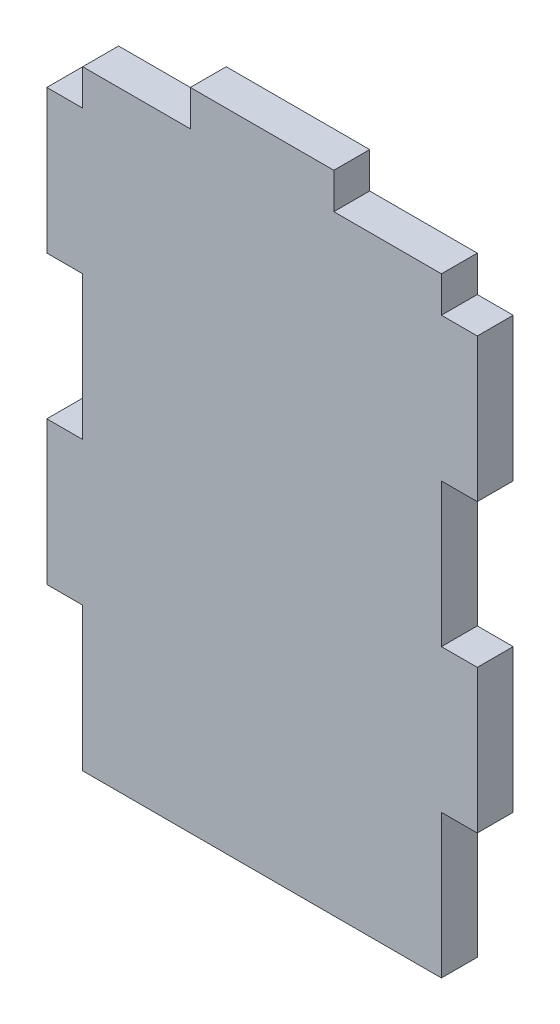
ISO-10303-21;
HEADER;
FILE_DESCRIPTION(('STEP AP214'),'2;1');
FILE_NAME('part.step','',(''),(''),'','','');
FILE_SCHEMA(('AUTOMOTIVE_DESIGN { 1 0 10303 214 1 1 1 1 }'));
ENDSEC;
DATA;
#1=APPLICATION_CONTEXT('core data for automotive mechanical design processes');
#2=APPLICATION_PROTOCOL_DEFINITION('international standard','automotive_design',2000,#1);
#3=PRODUCT_CONTEXT('',#1,'mechanical');
#4=PRODUCT('Part','Part','',(#3));
#5=PRODUCT_RELATED_PRODUCT_CATEGORY('part','',(#4));
#6=PRODUCT_DEFINITION_FORMATION('','',#4);
#7=PRODUCT_DEFINITION_CONTEXT('part definition',#1,'design');
#8=PRODUCT_DEFINITION('design','',#6,#7);
#9=PRODUCT_DEFINITION_SHAPE('','',#8);
#10=(LENGTH_UNIT() NAMED_UNIT(*) SI_UNIT(.MILLI.,.METRE.));
#11=(NAMED_UNIT(*) PLANE_ANGLE_UNIT() SI_UNIT($,.RADIAN.));
#12=(NAMED_UNIT(*) SI_UNIT($,.STERADIAN.) SOLID_ANGLE_UNIT());
#13=UNCERTAINTY_MEASURE_WITH_UNIT(LENGTH_MEASURE(1.E-05),#10,'distance_accuracy_value','');
#14=(GEOMETRIC_REPRESENTATION_CONTEXT(3) GLOBAL_UNCERTAINTY_ASSIGNED_CONTEXT((#13)) GLOBAL_UNIT_ASSIGNED_CONTEXT((#10,
#11,#12)) REPRESENTATION_CONTEXT('',''));
#15=CARTESIAN_POINT('',(0.,0.,0.));
#16=DIRECTION('',(0.,0.,1.));
#17=DIRECTION('',(1.,0.,0.));
#18=AXIS2_PLACEMENT_3D('',#15,#16,#17);
#19=CARTESIAN_POINT('',(-25.,42.5,5.));
#20=DIRECTION('',(0.,-1.,0.));
#21=DIRECTION('',(0.,0.,-1.));
#22=AXIS2_PLACEMENT_3D('',#19,#20,#21);
#23=PLANE('',#22);
#24=DIRECTION('',(0.,0.,1.));
#25=VECTOR('',#24,1.);
#26=CARTESIAN_POINT('',(-10.,42.5,-20.6155281280883));
#27=LINE('',#26,#25);
#28=CARTESIAN_POINT('',(-10.,42.5,0.));
#29=VERTEX_POINT('',#28);
#30=CARTESIAN_POINT('',(-10.,42.5,5.));
#31=VERTEX_POINT('',#30);
#32=EDGE_CURVE('E63',#29,#31,#27,.T.);
#33=ORIENTED_EDGE('',*,*,#32,.F.);
#34=DIRECTION('',(-1.,0.,0.));
#35=VECTOR('',#34,1.);
#36=CARTESIAN_POINT('',(-25.,42.5,0.));
#37=LINE('',#36,#35);
#38=CARTESIAN_POINT('',(-25.,42.5,0.));
#39=VERTEX_POINT('',#38);
#40=EDGE_CURVE('E406',#29,#39,#37,.T.);
#41=ORIENTED_EDGE('',*,*,#40,.T.);
#42=DIRECTION('',(0.,0.,-1.));
#43=VECTOR('',#42,1.);
#44=CARTESIAN_POINT('',(-25.,42.5,5.));
#45=LINE('',#44,#43);
#46=CARTESIAN_POINT('',(-25.,42.5,5.));
#47=VERTEX_POINT('',#46);
#48=EDGE_CURVE('E48',#47,#39,#45,.T.);
#49=ORIENTED_EDGE('',*,*,#48,.F.);
#50=DIRECTION('',(-1.,0.,0.));
#51=VECTOR('',#50,1.);
#52=CARTESIAN_POINT('',(-25.,42.5,5.));
#53=LINE('',#52,#51);
#54=EDGE_CURVE('E200',#31,#47,#53,.T.);
#55=ORIENTED_EDGE('',*,*,#54,.F.);
#56=EDGE_LOOP('',(#33,#41,#49,#55));
#57=FACE_BOUND('',#56,.T.);
#58=ADVANCED_FACE('F39',(#57),#23,.F.);
#59=CARTESIAN_POINT('',(25.,42.5,5.));
#60=DIRECTION('',(-1.,0.,0.));
#61=DIRECTION('',(0.,-1.,0.));
#62=AXIS2_PLACEMENT_3D('',#59,#60,#61);
#63=PLANE('',#62);
#64=DIRECTION('',(0.,0.,1.));
#65=VECTOR('',#64,1.);
#66=CARTESIAN_POINT('',(25.,17.5,-20.6155281280883));
#67=LINE('',#66,#65);
#68=CARTESIAN_POINT('',(25.,17.5,0.));
#69=VERTEX_POINT('',#68);
#70=CARTESIAN_POINT('',(25.,17.5,5.));
#71=VERTEX_POINT('',#70);
#72=EDGE_CURVE('E266',#69,#71,#67,.T.);
#73=ORIENTED_EDGE('',*,*,#72,.T.);
#74=DIRECTION('',(0.,1.,0.));
#75=VECTOR('',#74,1.);
#76=CARTESIAN_POINT('',(25.,42.5,5.));
#77=LINE('',#76,#75);
#78=CARTESIAN_POINT('',(25.,-2.50000000000001,5.));
#79=VERTEX_POINT('',#78);
#80=EDGE_CURVE('E389',#79,#71,#77,.T.);
#81=ORIENTED_EDGE('',*,*,#80,.F.);
#82=DIRECTION('',(0.,0.,1.));
#83=VECTOR('',#82,1.);
#84=CARTESIAN_POINT('',(25.,-2.50000000000001,-20.6155281280883));
#85=LINE('',#84,#83);
#86=CARTESIAN_POINT('',(25.,-2.50000000000001,0.));
#87=VERTEX_POINT('',#86);
#88=EDGE_CURVE('E302',#87,#79,#85,.T.);
#89=ORIENTED_EDGE('',*,*,#88,.F.);
#90=DIRECTION('',(0.,1.,0.));
#91=VECTOR('',#90,1.);
#92=CARTESIAN_POINT('',(25.,42.5,0.));
#93=LINE('',#92,#91);
#94=EDGE_CURVE('E407',#87,#69,#93,.T.);
#95=ORIENTED_EDGE('',*,*,#94,.T.);
#96=EDGE_LOOP('',(#73,#81,#89,#95));
#97=FACE_BOUND('',#96,.T.);
#98=ADVANCED_FACE('F482',(#97),#63,.F.);
#99=DIRECTION('',(0.,0.,1.));
#100=VECTOR('',#99,1.);
#101=CARTESIAN_POINT('',(25.,37.5,-20.6155281280883));
#102=LINE('',#101,#100);
#103=CARTESIAN_POINT('',(25.,37.5,0.));
#104=VERTEX_POINT('',#103);
#105=CARTESIAN_POINT('',(25.,37.5,5.));
#106=VERTEX_POINT('',#105);
#107=EDGE_CURVE('E267',#104,#106,#102,.T.);
#108=ORIENTED_EDGE('',*,*,#107,.F.);
#109=CARTESIAN_POINT('',(25.,42.5,0.));
#110=VERTEX_POINT('',#109);
#111=EDGE_CURVE('E387',#104,#110,#93,.T.);
#112=ORIENTED_EDGE('',*,*,#111,.T.);
#113=DIRECTION('',(0.,0.,-1.));
#114=VECTOR('',#113,1.);
#115=CARTESIAN_POINT('',(25.,42.5,5.));
#116=LINE('',#115,#114);
#117=CARTESIAN_POINT('',(25.,42.5,5.));
#118=VERTEX_POINT('',#117);
#119=EDGE_CURVE('E11',#118,#110,#116,.T.);
#120=ORIENTED_EDGE('',*,*,#119,.F.);
#121=EDGE_CURVE('E390',#106,#118,#77,.T.);
#122=ORIENTED_EDGE('',*,*,#121,.F.);
#123=EDGE_LOOP('',(#108,#112,#120,#122));
#124=FACE_BOUND('',#123,.T.);
#125=ADVANCED_FACE('F494',(#124),#63,.F.);
#126=CARTESIAN_POINT('',(-25.,42.5,5.));
#127=DIRECTION('',(1.,0.,0.));
#128=DIRECTION('',(0.,1.,0.));
#129=AXIS2_PLACEMENT_3D('',#126,#127,#128);
#130=PLANE('',#129);
#131=DIRECTION('',(0.,-1.,0.));
#132=VECTOR('',#131,1.);
#133=CARTESIAN_POINT('',(-25.,42.5,5.));
#134=LINE('',#133,#132);
#135=CARTESIAN_POINT('',(-25.,17.5,5.));
#136=VERTEX_POINT('',#135);
#137=CARTESIAN_POINT('',(-25.,-2.50000000000001,5.));
#138=VERTEX_POINT('',#137);
#139=EDGE_CURVE('E398',#136,#138,#134,.T.);
#140=ORIENTED_EDGE('',*,*,#139,.F.);
#141=DIRECTION('',(0.,0.,1.));
#142=VECTOR('',#141,1.);
#143=CARTESIAN_POINT('',(-25.,17.5,-20.6155281280883));
#144=LINE('',#143,#142);
#145=CARTESIAN_POINT('',(-25.,17.5,0.));
#146=VERTEX_POINT('',#145);
#147=EDGE_CURVE('E321',#146,#136,#144,.T.);
#148=ORIENTED_EDGE('',*,*,#147,.F.);
#149=DIRECTION('',(0.,-1.,0.));
#150=VECTOR('',#149,1.);
#151=CARTESIAN_POINT('',(-25.,42.5,0.));
#152=LINE('',#151,#150);
#153=CARTESIAN_POINT('',(-25.,-2.50000000000001,0.));
#154=VERTEX_POINT('',#153);
#155=EDGE_CURVE('E416',#146,#154,#152,.T.);
#156=ORIENTED_EDGE('',*,*,#155,.T.);
#157=DIRECTION('',(0.,0.,1.));
#158=VECTOR('',#157,1.);
#159=CARTESIAN_POINT('',(-25.,-2.50000000000001,-20.6155281280883));
#160=LINE('',#159,#158);
#161=EDGE_CURVE('E371',#154,#138,#160,.T.);
#162=ORIENTED_EDGE('',*,*,#161,.T.);
#163=EDGE_LOOP('',(#140,#148,#156,#162));
#164=FACE_BOUND('',#163,.T.);
#165=ADVANCED_FACE('F448',(#164),#130,.F.);
#166=DIRECTION('',(0.,0.,1.));
#167=VECTOR('',#166,1.);
#168=CARTESIAN_POINT('',(-25.,-22.5,-20.6155281280883));
#169=LINE('',#168,#167);
#170=CARTESIAN_POINT('',(-25.,-22.5,0.));
#171=VERTEX_POINT('',#170);
#172=CARTESIAN_POINT('',(-25.,-22.5,5.));
#173=VERTEX_POINT('',#172);
#174=EDGE_CURVE('E356',#171,#173,#169,.T.);
#175=ORIENTED_EDGE('',*,*,#174,.F.);
#176=CARTESIAN_POINT('',(-25.,-42.5,0.));
#177=VERTEX_POINT('',#176);
#178=EDGE_CURVE('E411',#171,#177,#152,.T.);
#179=ORIENTED_EDGE('',*,*,#178,.T.);
#180=DIRECTION('',(0.,0.,-1.));
#181=VECTOR('',#180,1.);
#182=CARTESIAN_POINT('',(-25.,-42.5,5.));
#183=LINE('',#182,#181);
#184=CARTESIAN_POINT('',(-25.,-42.5,5.));
#185=VERTEX_POINT('',#184);
#186=EDGE_CURVE('E422',#185,#177,#183,.T.);
#187=ORIENTED_EDGE('',*,*,#186,.F.);
#188=EDGE_CURVE('E393',#173,#185,#134,.T.);
#189=ORIENTED_EDGE('',*,*,#188,.F.);
#190=EDGE_LOOP('',(#175,#179,#187,#189));
#191=FACE_BOUND('',#190,.T.);
#192=ADVANCED_FACE('F458',(#191),#130,.F.);
#193=CARTESIAN_POINT('',(25.,-42.5,0.));
#194=VERTEX_POINT('',#193);
#195=CARTESIAN_POINT('',(25.,-22.5,0.));
#196=VERTEX_POINT('',#195);
#197=EDGE_CURVE('E402',#194,#196,#93,.T.);
#198=ORIENTED_EDGE('',*,*,#197,.T.);
#199=DIRECTION('',(0.,0.,1.));
#200=VECTOR('',#199,1.);
#201=CARTESIAN_POINT('',(25.,-22.5,-20.6155281280883));
#202=LINE('',#201,#200);
#203=CARTESIAN_POINT('',(25.,-22.5,5.));
#204=VERTEX_POINT('',#203);
#205=EDGE_CURVE('E301',#196,#204,#202,.T.);
#206=ORIENTED_EDGE('',*,*,#205,.T.);
#207=CARTESIAN_POINT('',(25.,-42.5,5.));
#208=VERTEX_POINT('',#207);
#209=EDGE_CURVE('E208',#208,#204,#77,.T.);
#210=ORIENTED_EDGE('',*,*,#209,.F.);
#211=DIRECTION('',(0.,0.,-1.));
#212=VECTOR('',#211,1.);
#213=CARTESIAN_POINT('',(25.,-42.5,5.));
#214=LINE('',#213,#212);
#215=EDGE_CURVE('E401',#208,#194,#214,.T.);
#216=ORIENTED_EDGE('',*,*,#215,.T.);
#217=EDGE_LOOP('',(#198,#206,#210,#216));
#218=FACE_BOUND('',#217,.T.);
#219=ADVANCED_FACE('F41',(#218),#63,.F.);
#220=CARTESIAN_POINT('',(10.,42.5,0.));
#221=VERTEX_POINT('',#220);
#222=EDGE_CURVE('E408',#110,#221,#37,.T.);
#223=ORIENTED_EDGE('',*,*,#222,.T.);
#224=DIRECTION('',(0.,0.,1.));
#225=VECTOR('',#224,1.);
#226=CARTESIAN_POINT('',(10.,42.5,-20.6155281280883));
#227=LINE('',#226,#225);
#228=CARTESIAN_POINT('',(10.,42.5,5.));
#229=VERTEX_POINT('',#228);
#230=EDGE_CURVE('E55',#221,#229,#227,.T.);
#231=ORIENTED_EDGE('',*,*,#230,.T.);
#232=EDGE_CURVE('E207',#118,#229,#53,.T.);
#233=ORIENTED_EDGE('',*,*,#232,.F.);
#234=ORIENTED_EDGE('',*,*,#119,.T.);
#235=EDGE_LOOP('',(#223,#231,#233,#234));
#236=FACE_BOUND('',#235,.T.);
#237=ADVANCED_FACE('F493',(#236),#23,.F.);
#238=CARTESIAN_POINT('',(-25.,37.5,0.));
#239=VERTEX_POINT('',#238);
#240=EDGE_CURVE('E412',#39,#239,#152,.T.);
#241=ORIENTED_EDGE('',*,*,#240,.T.);
#242=DIRECTION('',(0.,0.,1.));
#243=VECTOR('',#242,1.);
#244=CARTESIAN_POINT('',(-25.,37.5,-20.6155281280883));
#245=LINE('',#244,#243);
#246=CARTESIAN_POINT('',(-25.,37.5,5.));
#247=VERTEX_POINT('',#246);
#248=EDGE_CURVE('E336',#239,#247,#245,.T.);
#249=ORIENTED_EDGE('',*,*,#248,.T.);
#250=EDGE_CURVE('E394',#47,#247,#134,.T.);
#251=ORIENTED_EDGE('',*,*,#250,.F.);
#252=ORIENTED_EDGE('',*,*,#48,.T.);
#253=EDGE_LOOP('',(#241,#249,#251,#252));
#254=FACE_BOUND('',#253,.T.);
#255=ADVANCED_FACE('F428',(#254),#130,.F.);
#256=CARTESIAN_POINT('',(-25.,-42.5,5.));
#257=DIRECTION('',(0.,1.,0.));
#258=DIRECTION('',(0.,0.,1.));
#259=AXIS2_PLACEMENT_3D('',#256,#257,#258);
#260=PLANE('',#259);
#261=DIRECTION('',(1.,0.,0.));
#262=VECTOR('',#261,1.);
#263=CARTESIAN_POINT('',(-25.,-42.5,0.));
#264=LINE('',#263,#262);
#265=EDGE_CURVE('E415',#177,#194,#264,.T.);
#266=ORIENTED_EDGE('',*,*,#265,.T.);
#267=ORIENTED_EDGE('',*,*,#215,.F.);
#268=DIRECTION('',(1.,0.,0.));
#269=VECTOR('',#268,1.);
#270=CARTESIAN_POINT('',(-25.,-42.5,5.));
#271=LINE('',#270,#269);
#272=EDGE_CURVE('E397',#185,#208,#271,.T.);
#273=ORIENTED_EDGE('',*,*,#272,.F.);
#274=ORIENTED_EDGE('',*,*,#186,.T.);
#275=EDGE_LOOP('',(#266,#267,#273,#274));
#276=FACE_BOUND('',#275,.T.);
#277=ADVANCED_FACE('F462',(#276),#260,.F.);
#278=CARTESIAN_POINT('',(0.,0.,5.));
#279=DIRECTION('',(0.,0.,1.));
#280=DIRECTION('',(1.,0.,0.));
#281=AXIS2_PLACEMENT_3D('',#278,#279,#280);
#282=PLANE('',#281);
#283=ORIENTED_EDGE('',*,*,#209,.T.);
#284=DIRECTION('',(-1.,0.,0.));
#285=VECTOR('',#284,1.);
#286=CARTESIAN_POINT('',(25.,-22.5,5.));
#287=LINE('',#286,#285);
#288=CARTESIAN_POINT('',(30.,-22.5,5.));
#289=VERTEX_POINT('',#288);
#290=EDGE_CURVE('E253',#289,#204,#287,.T.);
#291=ORIENTED_EDGE('',*,*,#290,.F.);
#292=DIRECTION('',(0.,-1.,0.));
#293=VECTOR('',#292,1.);
#294=CARTESIAN_POINT('',(30.,-22.5,5.));
#295=LINE('',#294,#293);
#296=CARTESIAN_POINT('',(30.,-2.50000000000001,5.));
#297=VERTEX_POINT('',#296);
#298=EDGE_CURVE('E293',#297,#289,#295,.T.);
#299=ORIENTED_EDGE('',*,*,#298,.F.);
#300=DIRECTION('',(1.,0.,0.));
#301=VECTOR('',#300,1.);
#302=CARTESIAN_POINT('',(25.,-2.50000000000001,5.));
#303=LINE('',#302,#301);
#304=EDGE_CURVE('E297',#79,#297,#303,.T.);
#305=ORIENTED_EDGE('',*,*,#304,.F.);
#306=ORIENTED_EDGE('',*,*,#80,.T.);
#307=DIRECTION('',(-1.,0.,0.));
#308=VECTOR('',#307,1.);
#309=CARTESIAN_POINT('',(25.,17.5,5.));
#310=LINE('',#309,#308);
#311=CARTESIAN_POINT('',(30.,17.5,5.));
#312=VERTEX_POINT('',#311);
#313=EDGE_CURVE('E254',#312,#71,#310,.T.);
#314=ORIENTED_EDGE('',*,*,#313,.F.);
#315=DIRECTION('',(0.,-1.,0.));
#316=VECTOR('',#315,1.);
#317=CARTESIAN_POINT('',(30.,17.5,5.));
#318=LINE('',#317,#316);
#319=CARTESIAN_POINT('',(30.,37.5,5.));
#320=VERTEX_POINT('',#319);
#321=EDGE_CURVE('E258',#320,#312,#318,.T.);
#322=ORIENTED_EDGE('',*,*,#321,.F.);
#323=DIRECTION('',(1.,0.,0.));
#324=VECTOR('',#323,1.);
#325=CARTESIAN_POINT('',(25.,37.5,5.));
#326=LINE('',#325,#324);
#327=EDGE_CURVE('E262',#106,#320,#326,.T.);
#328=ORIENTED_EDGE('',*,*,#327,.F.);
#329=ORIENTED_EDGE('',*,*,#121,.T.);
#330=ORIENTED_EDGE('',*,*,#232,.T.);
#331=DIRECTION('',(0.,1.,0.));
#332=VECTOR('',#331,1.);
#333=CARTESIAN_POINT('',(10.,42.5,5.));
#334=LINE('',#333,#332);
#335=CARTESIAN_POINT('',(9.99999999999999,47.5,5.));
#336=VERTEX_POINT('',#335);
#337=EDGE_CURVE('E226',#229,#336,#334,.T.);
#338=ORIENTED_EDGE('',*,*,#337,.T.);
#339=DIRECTION('',(-1.,0.,0.));
#340=VECTOR('',#339,1.);
#341=CARTESIAN_POINT('',(-10.,47.5,5.));
#342=LINE('',#341,#340);
#343=CARTESIAN_POINT('',(-10.,47.5,5.));
#344=VERTEX_POINT('',#343);
#345=EDGE_CURVE('E219',#336,#344,#342,.T.);
#346=ORIENTED_EDGE('',*,*,#345,.T.);
#347=DIRECTION('',(0.,-1.,0.));
#348=VECTOR('',#347,1.);
#349=CARTESIAN_POINT('',(-10.,42.5,5.));
#350=LINE('',#349,#348);
#351=EDGE_CURVE('E215',#344,#31,#350,.T.);
#352=ORIENTED_EDGE('',*,*,#351,.T.);
#353=ORIENTED_EDGE('',*,*,#54,.T.);
#354=ORIENTED_EDGE('',*,*,#250,.T.);
#355=DIRECTION('',(-1.,0.,0.));
#356=VECTOR('',#355,1.);
#357=CARTESIAN_POINT('',(-25.,37.5,5.));
#358=LINE('',#357,#356);
#359=CARTESIAN_POINT('',(-30.,37.5,5.));
#360=VERTEX_POINT('',#359);
#361=EDGE_CURVE('E290',#247,#360,#358,.T.);
#362=ORIENTED_EDGE('',*,*,#361,.T.);
#363=DIRECTION('',(0.,-1.,0.));
#364=VECTOR('',#363,1.);
#365=CARTESIAN_POINT('',(-30.,17.5,5.));
#366=LINE('',#365,#364);
#367=CARTESIAN_POINT('',(-30.,17.5,5.));
#368=VERTEX_POINT('',#367);
#369=EDGE_CURVE('E328',#360,#368,#366,.T.);
#370=ORIENTED_EDGE('',*,*,#369,.T.);
#371=DIRECTION('',(1.,0.,0.));
#372=VECTOR('',#371,1.);
#373=CARTESIAN_POINT('',(-25.,17.5,5.));
#374=LINE('',#373,#372);
#375=EDGE_CURVE('E332',#368,#136,#374,.T.);
#376=ORIENTED_EDGE('',*,*,#375,.T.);
#377=ORIENTED_EDGE('',*,*,#139,.T.);
#378=DIRECTION('',(-1.,0.,0.));
#379=VECTOR('',#378,1.);
#380=CARTESIAN_POINT('',(-25.,-2.50000000000001,5.));
#381=LINE('',#380,#379);
#382=CARTESIAN_POINT('',(-30.,-2.50000000000001,5.));
#383=VERTEX_POINT('',#382);
#384=EDGE_CURVE('E351',#138,#383,#381,.T.);
#385=ORIENTED_EDGE('',*,*,#384,.T.);
#386=DIRECTION('',(0.,-1.,0.));
#387=VECTOR('',#386,1.);
#388=CARTESIAN_POINT('',(-30.,-22.5,5.));
#389=LINE('',#388,#387);
#390=CARTESIAN_POINT('',(-30.,-22.5,5.));
#391=VERTEX_POINT('',#390);
#392=EDGE_CURVE('E363',#383,#391,#389,.T.);
#393=ORIENTED_EDGE('',*,*,#392,.T.);
#394=DIRECTION('',(1.,0.,0.));
#395=VECTOR('',#394,1.);
#396=CARTESIAN_POINT('',(-25.,-22.5,5.));
#397=LINE('',#396,#395);
#398=EDGE_CURVE('E367',#391,#173,#397,.T.);
#399=ORIENTED_EDGE('',*,*,#398,.T.);
#400=ORIENTED_EDGE('',*,*,#188,.T.);
#401=ORIENTED_EDGE('',*,*,#272,.T.);
#402=EDGE_LOOP('',(#283,#291,#299,#305,#306,#314,#322,#328,#329,#330,#338,#346,#352,#353,#354,
#362,#370,#376,#377,#385,#393,#399,#400,#401));
#403=FACE_BOUND('',#402,.T.);
#404=ADVANCED_FACE('F222',(#403),#282,.T.);
#405=CARTESIAN_POINT('',(0.,0.,0.));
#406=DIRECTION('',(0.,0.,1.));
#407=DIRECTION('',(1.,0.,0.));
#408=AXIS2_PLACEMENT_3D('',#405,#406,#407);
#409=PLANE('',#408);
#410=ORIENTED_EDGE('',*,*,#197,.F.);
#411=ORIENTED_EDGE('',*,*,#265,.F.);
#412=ORIENTED_EDGE('',*,*,#178,.F.);
#413=DIRECTION('',(-1.,0.,0.));
#414=VECTOR('',#413,1.);
#415=CARTESIAN_POINT('',(-25.,-22.5,0.));
#416=LINE('',#415,#414);
#417=CARTESIAN_POINT('',(-30.,-22.5,0.));
#418=VERTEX_POINT('',#417);
#419=EDGE_CURVE('E355',#171,#418,#416,.T.);
#420=ORIENTED_EDGE('',*,*,#419,.T.);
#421=DIRECTION('',(0.,1.,0.));
#422=VECTOR('',#421,1.);
#423=CARTESIAN_POINT('',(-30.,-22.5,0.));
#424=LINE('',#423,#422);
#425=CARTESIAN_POINT('',(-30.,-2.50000000000001,0.));
#426=VERTEX_POINT('',#425);
#427=EDGE_CURVE('E352',#418,#426,#424,.T.);
#428=ORIENTED_EDGE('',*,*,#427,.T.);
#429=DIRECTION('',(1.,0.,0.));
#430=VECTOR('',#429,1.);
#431=CARTESIAN_POINT('',(-25.,-2.50000000000001,0.));
#432=LINE('',#431,#430);
#433=EDGE_CURVE('E359',#426,#154,#432,.T.);
#434=ORIENTED_EDGE('',*,*,#433,.T.);
#435=ORIENTED_EDGE('',*,*,#155,.F.);
#436=DIRECTION('',(-1.,0.,0.));
#437=VECTOR('',#436,1.);
#438=CARTESIAN_POINT('',(-25.,17.5,0.));
#439=LINE('',#438,#437);
#440=CARTESIAN_POINT('',(-30.,17.5,0.));
#441=VERTEX_POINT('',#440);
#442=EDGE_CURVE('E320',#146,#441,#439,.T.);
#443=ORIENTED_EDGE('',*,*,#442,.T.);
#444=DIRECTION('',(0.,1.,0.));
#445=VECTOR('',#444,1.);
#446=CARTESIAN_POINT('',(-30.,17.5,0.));
#447=LINE('',#446,#445);
#448=CARTESIAN_POINT('',(-30.,37.5,0.));
#449=VERTEX_POINT('',#448);
#450=EDGE_CURVE('E317',#441,#449,#447,.T.);
#451=ORIENTED_EDGE('',*,*,#450,.T.);
#452=DIRECTION('',(1.,0.,0.));
#453=VECTOR('',#452,1.);
#454=CARTESIAN_POINT('',(-25.,37.5,0.));
#455=LINE('',#454,#453);
#456=EDGE_CURVE('E324',#449,#239,#455,.T.);
#457=ORIENTED_EDGE('',*,*,#456,.T.);
#458=ORIENTED_EDGE('',*,*,#240,.F.);
#459=ORIENTED_EDGE('',*,*,#40,.F.);
#460=DIRECTION('',(0.,1.,0.));
#461=VECTOR('',#460,1.);
#462=CARTESIAN_POINT('',(-10.,42.5,0.));
#463=LINE('',#462,#461);
#464=CARTESIAN_POINT('',(-10.,47.5,0.));
#465=VERTEX_POINT('',#464);
#466=EDGE_CURVE('E217',#29,#465,#463,.T.);
#467=ORIENTED_EDGE('',*,*,#466,.T.);
#468=DIRECTION('',(1.,0.,0.));
#469=VECTOR('',#468,1.);
#470=CARTESIAN_POINT('',(-10.,47.5,0.));
#471=LINE('',#470,#469);
#472=CARTESIAN_POINT('',(9.99999999999999,47.5,0.));
#473=VERTEX_POINT('',#472);
#474=EDGE_CURVE('E500',#465,#473,#471,.T.);
#475=ORIENTED_EDGE('',*,*,#474,.T.);
#476=DIRECTION('',(0.,-1.,0.));
#477=VECTOR('',#476,1.);
#478=CARTESIAN_POINT('',(10.,42.5,0.));
#479=LINE('',#478,#477);
#480=EDGE_CURVE('E238',#473,#221,#479,.T.);
#481=ORIENTED_EDGE('',*,*,#480,.T.);
#482=ORIENTED_EDGE('',*,*,#222,.F.);
#483=ORIENTED_EDGE('',*,*,#111,.F.);
#484=DIRECTION('',(-1.,0.,0.));
#485=VECTOR('',#484,1.);
#486=CARTESIAN_POINT('',(25.,37.5,0.));
#487=LINE('',#486,#485);
#488=CARTESIAN_POINT('',(30.,37.5,0.));
#489=VERTEX_POINT('',#488);
#490=EDGE_CURVE('E248',#489,#104,#487,.T.);
#491=ORIENTED_EDGE('',*,*,#490,.F.);
#492=DIRECTION('',(0.,1.,0.));
#493=VECTOR('',#492,1.);
#494=CARTESIAN_POINT('',(30.,17.5,0.));
#495=LINE('',#494,#493);
#496=CARTESIAN_POINT('',(30.,17.5,0.));
#497=VERTEX_POINT('',#496);
#498=EDGE_CURVE('E244',#497,#489,#495,.T.);
#499=ORIENTED_EDGE('',*,*,#498,.F.);
#500=DIRECTION('',(1.,0.,0.));
#501=VECTOR('',#500,1.);
#502=CARTESIAN_POINT('',(25.,17.5,0.));
#503=LINE('',#502,#501);
#504=EDGE_CURVE('E249',#69,#497,#503,.T.);
#505=ORIENTED_EDGE('',*,*,#504,.F.);
#506=ORIENTED_EDGE('',*,*,#94,.F.);
#507=DIRECTION('',(-1.,0.,0.));
#508=VECTOR('',#507,1.);
#509=CARTESIAN_POINT('',(25.,-2.50000000000001,0.));
#510=LINE('',#509,#508);
#511=CARTESIAN_POINT('',(30.,-2.50000000000001,0.));
#512=VERTEX_POINT('',#511);
#513=EDGE_CURVE('E286',#512,#87,#510,.T.);
#514=ORIENTED_EDGE('',*,*,#513,.F.);
#515=DIRECTION('',(0.,1.,0.));
#516=VECTOR('',#515,1.);
#517=CARTESIAN_POINT('',(30.,-22.5,0.));
#518=LINE('',#517,#516);
#519=CARTESIAN_POINT('',(30.,-22.5,0.));
#520=VERTEX_POINT('',#519);
#521=EDGE_CURVE('E282',#520,#512,#518,.T.);
#522=ORIENTED_EDGE('',*,*,#521,.F.);
#523=DIRECTION('',(1.,0.,0.));
#524=VECTOR('',#523,1.);
#525=CARTESIAN_POINT('',(25.,-22.5,0.));
#526=LINE('',#525,#524);
#527=EDGE_CURVE('E287',#196,#520,#526,.T.);
#528=ORIENTED_EDGE('',*,*,#527,.F.);
#529=EDGE_LOOP('',(#410,#411,#412,#420,#428,#434,#435,#443,#451,#457,#458,#459,#467,#475,#481,
#482,#483,#491,#499,#505,#506,#514,#522,#528));
#530=FACE_BOUND('',#529,.T.);
#531=ADVANCED_FACE('F431',(#530),#409,.F.);
#532=CARTESIAN_POINT('',(-25.,-22.5,-20.6155281280883));
#533=DIRECTION('',(0.,-1.,0.));
#534=DIRECTION('',(1.,0.,0.));
#535=AXIS2_PLACEMENT_3D('',#532,#533,#534);
#536=PLANE('',#535);
#537=ORIENTED_EDGE('',*,*,#419,.F.);
#538=ORIENTED_EDGE('',*,*,#174,.T.);
#539=ORIENTED_EDGE('',*,*,#398,.F.);
#540=DIRECTION('',(0.,0.,1.));
#541=VECTOR('',#540,1.);
#542=CARTESIAN_POINT('',(-30.,-22.5,-20.6155281280883));
#543=LINE('',#542,#541);
#544=EDGE_CURVE('E375',#418,#391,#543,.T.);
#545=ORIENTED_EDGE('',*,*,#544,.F.);
#546=EDGE_LOOP('',(#537,#538,#539,#545));
#547=FACE_BOUND('',#546,.T.);
#548=ADVANCED_FACE('F555',(#547),#536,.T.);
#549=CARTESIAN_POINT('',(-30.,-22.5,-20.6155281280883));
#550=DIRECTION('',(-1.,0.,0.));
#551=DIRECTION('',(0.,0.,1.));
#552=AXIS2_PLACEMENT_3D('',#549,#550,#551);
#553=PLANE('',#552);
#554=ORIENTED_EDGE('',*,*,#427,.F.);
#555=ORIENTED_EDGE('',*,*,#544,.T.);
#556=ORIENTED_EDGE('',*,*,#392,.F.);
#557=DIRECTION('',(0.,0.,1.));
#558=VECTOR('',#557,1.);
#559=CARTESIAN_POINT('',(-30.,-2.50000000000001,-20.6155281280883));
#560=LINE('',#559,#558);
#561=EDGE_CURVE('E378',#426,#383,#560,.T.);
#562=ORIENTED_EDGE('',*,*,#561,.F.);
#563=EDGE_LOOP('',(#554,#555,#556,#562));
#564=FACE_BOUND('',#563,.T.);
#565=ADVANCED_FACE('F561',(#564),#553,.T.);
#566=CARTESIAN_POINT('',(-25.,-2.50000000000001,-20.6155281280883));
#567=DIRECTION('',(0.,1.,0.));
#568=DIRECTION('',(0.,0.,1.));
#569=AXIS2_PLACEMENT_3D('',#566,#567,#568);
#570=PLANE('',#569);
#571=ORIENTED_EDGE('',*,*,#433,.F.);
#572=ORIENTED_EDGE('',*,*,#561,.T.);
#573=ORIENTED_EDGE('',*,*,#384,.F.);
#574=ORIENTED_EDGE('',*,*,#161,.F.);
#575=EDGE_LOOP('',(#571,#572,#573,#574));
#576=FACE_BOUND('',#575,.T.);
#577=ADVANCED_FACE('F558',(#576),#570,.T.);
#578=CARTESIAN_POINT('',(-25.,17.5,-20.6155281280883));
#579=DIRECTION('',(0.,-1.,0.));
#580=DIRECTION('',(1.,0.,0.));
#581=AXIS2_PLACEMENT_3D('',#578,#579,#580);
#582=PLANE('',#581);
#583=ORIENTED_EDGE('',*,*,#442,.F.);
#584=ORIENTED_EDGE('',*,*,#147,.T.);
#585=ORIENTED_EDGE('',*,*,#375,.F.);
#586=DIRECTION('',(0.,0.,1.));
#587=VECTOR('',#586,1.);
#588=CARTESIAN_POINT('',(-30.,17.5,-20.6155281280883));
#589=LINE('',#588,#587);
#590=EDGE_CURVE('E340',#441,#368,#589,.T.);
#591=ORIENTED_EDGE('',*,*,#590,.F.);
#592=EDGE_LOOP('',(#583,#584,#585,#591));
#593=FACE_BOUND('',#592,.T.);
#594=ADVANCED_FACE('F445',(#593),#582,.T.);
#595=CARTESIAN_POINT('',(-30.,17.5,-20.6155281280883));
#596=DIRECTION('',(-1.,0.,0.));
#597=DIRECTION('',(0.,0.,1.));
#598=AXIS2_PLACEMENT_3D('',#595,#596,#597);
#599=PLANE('',#598);
#600=ORIENTED_EDGE('',*,*,#450,.F.);
#601=ORIENTED_EDGE('',*,*,#590,.T.);
#602=ORIENTED_EDGE('',*,*,#369,.F.);
#603=DIRECTION('',(0.,0.,1.));
#604=VECTOR('',#603,1.);
#605=CARTESIAN_POINT('',(-30.,37.5,-20.6155281280883));
#606=LINE('',#605,#604);
#607=EDGE_CURVE('E343',#449,#360,#606,.T.);
#608=ORIENTED_EDGE('',*,*,#607,.F.);
#609=EDGE_LOOP('',(#600,#601,#602,#608));
#610=FACE_BOUND('',#609,.T.);
#611=ADVANCED_FACE('F571',(#610),#599,.T.);
#612=CARTESIAN_POINT('',(-25.,37.5,-20.6155281280883));
#613=DIRECTION('',(0.,1.,0.));
#614=DIRECTION('',(0.,0.,1.));
#615=AXIS2_PLACEMENT_3D('',#612,#613,#614);
#616=PLANE('',#615);
#617=ORIENTED_EDGE('',*,*,#456,.F.);
#618=ORIENTED_EDGE('',*,*,#607,.T.);
#619=ORIENTED_EDGE('',*,*,#361,.F.);
#620=ORIENTED_EDGE('',*,*,#248,.F.);
#621=EDGE_LOOP('',(#617,#618,#619,#620));
#622=FACE_BOUND('',#621,.T.);
#623=ADVANCED_FACE('F438',(#622),#616,.T.);
#624=CARTESIAN_POINT('',(25.,-22.5,-20.6155281280883));
#625=DIRECTION('',(0.,1.,0.));
#626=DIRECTION('',(-1.,0.,0.));
#627=AXIS2_PLACEMENT_3D('',#624,#625,#626);
#628=PLANE('',#627);
#629=ORIENTED_EDGE('',*,*,#205,.F.);
#630=ORIENTED_EDGE('',*,*,#527,.T.);
#631=DIRECTION('',(0.,0.,1.));
#632=VECTOR('',#631,1.);
#633=CARTESIAN_POINT('',(30.,-22.5,-20.6155281280883));
#634=LINE('',#633,#632);
#635=EDGE_CURVE('E308',#520,#289,#634,.T.);
#636=ORIENTED_EDGE('',*,*,#635,.T.);
#637=ORIENTED_EDGE('',*,*,#290,.T.);
#638=EDGE_LOOP('',(#629,#630,#636,#637));
#639=FACE_BOUND('',#638,.T.);
#640=ADVANCED_FACE('F470',(#639),#628,.F.);
#641=CARTESIAN_POINT('',(30.,-22.5,-20.6155281280883));
#642=DIRECTION('',(-1.,0.,0.));
#643=DIRECTION('',(0.,0.,1.));
#644=AXIS2_PLACEMENT_3D('',#641,#642,#643);
#645=PLANE('',#644);
#646=ORIENTED_EDGE('',*,*,#635,.F.);
#647=ORIENTED_EDGE('',*,*,#521,.T.);
#648=DIRECTION('',(0.,0.,1.));
#649=VECTOR('',#648,1.);
#650=CARTESIAN_POINT('',(30.,-2.50000000000001,-20.6155281280883));
#651=LINE('',#650,#649);
#652=EDGE_CURVE('E305',#512,#297,#651,.T.);
#653=ORIENTED_EDGE('',*,*,#652,.T.);
#654=ORIENTED_EDGE('',*,*,#298,.T.);
#655=EDGE_LOOP('',(#646,#647,#653,#654));
#656=FACE_BOUND('',#655,.T.);
#657=ADVANCED_FACE('F473',(#656),#645,.F.);
#658=CARTESIAN_POINT('',(25.,-2.50000000000001,-20.6155281280883));
#659=DIRECTION('',(0.,-1.,0.));
#660=DIRECTION('',(0.,0.,-1.));
#661=AXIS2_PLACEMENT_3D('',#658,#659,#660);
#662=PLANE('',#661);
#663=ORIENTED_EDGE('',*,*,#652,.F.);
#664=ORIENTED_EDGE('',*,*,#513,.T.);
#665=ORIENTED_EDGE('',*,*,#88,.T.);
#666=ORIENTED_EDGE('',*,*,#304,.T.);
#667=EDGE_LOOP('',(#663,#664,#665,#666));
#668=FACE_BOUND('',#667,.T.);
#669=ADVANCED_FACE('F476',(#668),#662,.F.);
#670=CARTESIAN_POINT('',(25.,17.5,-20.6155281280883));
#671=DIRECTION('',(0.,1.,0.));
#672=DIRECTION('',(-1.,0.,0.));
#673=AXIS2_PLACEMENT_3D('',#670,#671,#672);
#674=PLANE('',#673);
#675=ORIENTED_EDGE('',*,*,#72,.F.);
#676=ORIENTED_EDGE('',*,*,#504,.T.);
#677=DIRECTION('',(0.,0.,1.));
#678=VECTOR('',#677,1.);
#679=CARTESIAN_POINT('',(30.,17.5,-20.6155281280883));
#680=LINE('',#679,#678);
#681=EDGE_CURVE('E274',#497,#312,#680,.T.);
#682=ORIENTED_EDGE('',*,*,#681,.T.);
#683=ORIENTED_EDGE('',*,*,#313,.T.);
#684=EDGE_LOOP('',(#675,#676,#682,#683));
#685=FACE_BOUND('',#684,.T.);
#686=ADVANCED_FACE('F517',(#685),#674,.F.);
#687=CARTESIAN_POINT('',(30.,17.5,-20.6155281280883));
#688=DIRECTION('',(-1.,0.,0.));
#689=DIRECTION('',(0.,0.,1.));
#690=AXIS2_PLACEMENT_3D('',#687,#688,#689);
#691=PLANE('',#690);
#692=ORIENTED_EDGE('',*,*,#681,.F.);
#693=ORIENTED_EDGE('',*,*,#498,.T.);
#694=DIRECTION('',(0.,0.,1.));
#695=VECTOR('',#694,1.);
#696=CARTESIAN_POINT('',(30.,37.5,-20.6155281280883));
#697=LINE('',#696,#695);
#698=EDGE_CURVE('E271',#489,#320,#697,.T.);
#699=ORIENTED_EDGE('',*,*,#698,.T.);
#700=ORIENTED_EDGE('',*,*,#321,.T.);
#701=EDGE_LOOP('',(#692,#693,#699,#700));
#702=FACE_BOUND('',#701,.T.);
#703=ADVANCED_FACE('F519',(#702),#691,.F.);
#704=CARTESIAN_POINT('',(25.,37.5,-20.6155281280883));
#705=DIRECTION('',(0.,-1.,0.));
#706=DIRECTION('',(0.,0.,-1.));
#707=AXIS2_PLACEMENT_3D('',#704,#705,#706);
#708=PLANE('',#707);
#709=ORIENTED_EDGE('',*,*,#698,.F.);
#710=ORIENTED_EDGE('',*,*,#490,.T.);
#711=ORIENTED_EDGE('',*,*,#107,.T.);
#712=ORIENTED_EDGE('',*,*,#327,.T.);
#713=EDGE_LOOP('',(#709,#710,#711,#712));
#714=FACE_BOUND('',#713,.T.);
#715=ADVANCED_FACE('F522',(#714),#708,.F.);
#716=CARTESIAN_POINT('',(-10.,42.5,-20.6155281280883));
#717=DIRECTION('',(-1.,0.,0.));
#718=DIRECTION('',(0.,0.,1.));
#719=AXIS2_PLACEMENT_3D('',#716,#717,#718);
#720=PLANE('',#719);
#721=ORIENTED_EDGE('',*,*,#466,.F.);
#722=ORIENTED_EDGE('',*,*,#32,.T.);
#723=ORIENTED_EDGE('',*,*,#351,.F.);
#724=DIRECTION('',(0.,0.,1.));
#725=VECTOR('',#724,1.);
#726=CARTESIAN_POINT('',(-10.,47.5,-20.6155281280883));
#727=LINE('',#726,#725);
#728=EDGE_CURVE('E235',#465,#344,#727,.T.);
#729=ORIENTED_EDGE('',*,*,#728,.F.);
#730=EDGE_LOOP('',(#721,#722,#723,#729));
#731=FACE_BOUND('',#730,.T.);
#732=ADVANCED_FACE('F213',(#731),#720,.T.);
#733=CARTESIAN_POINT('',(-10.,47.5,-20.6155281280883));
#734=DIRECTION('',(0.,1.,0.));
#735=DIRECTION('',(0.,0.,1.));
#736=AXIS2_PLACEMENT_3D('',#733,#734,#735);
#737=PLANE('',#736);
#738=ORIENTED_EDGE('',*,*,#474,.F.);
#739=ORIENTED_EDGE('',*,*,#728,.T.);
#740=ORIENTED_EDGE('',*,*,#345,.F.);
#741=DIRECTION('',(0.,0.,1.));
#742=VECTOR('',#741,1.);
#743=CARTESIAN_POINT('',(9.99999999999999,47.5,-20.6155281280883));
#744=LINE('',#743,#742);
#745=EDGE_CURVE('E239',#473,#336,#744,.T.);
#746=ORIENTED_EDGE('',*,*,#745,.F.);
#747=EDGE_LOOP('',(#738,#739,#740,#746));
#748=FACE_BOUND('',#747,.T.);
#749=ADVANCED_FACE('F507',(#748),#737,.T.);
#750=CARTESIAN_POINT('',(10.,42.5,-20.6155281280883));
#751=DIRECTION('',(1.,0.,0.));
#752=DIRECTION('',(0.,1.,0.));
#753=AXIS2_PLACEMENT_3D('',#750,#751,#752);
#754=PLANE('',#753);
#755=ORIENTED_EDGE('',*,*,#480,.F.);
#756=ORIENTED_EDGE('',*,*,#745,.T.);
#757=ORIENTED_EDGE('',*,*,#337,.F.);
#758=ORIENTED_EDGE('',*,*,#230,.F.);
#759=EDGE_LOOP('',(#755,#756,#757,#758));
#760=FACE_BOUND('',#759,.T.);
#761=ADVANCED_FACE('F505',(#760),#754,.T.);
#762=CLOSED_SHELL('',(#58,#98,#125,#165,#192,#219,#237,#255,#277,#404,#531,#548,#565,#577,#594,
#611,#623,#640,#657,#669,#686,#703,#715,#732,#749,#761));
#763=MANIFOLD_SOLID_BREP('B2',#762);
#764=ADVANCED_BREP_SHAPE_REPRESENTATION('',(#18,#763),#14);
#765=SHAPE_DEFINITION_REPRESENTATION(#9,#764);
ENDSEC;
END-ISO-10303-21;
